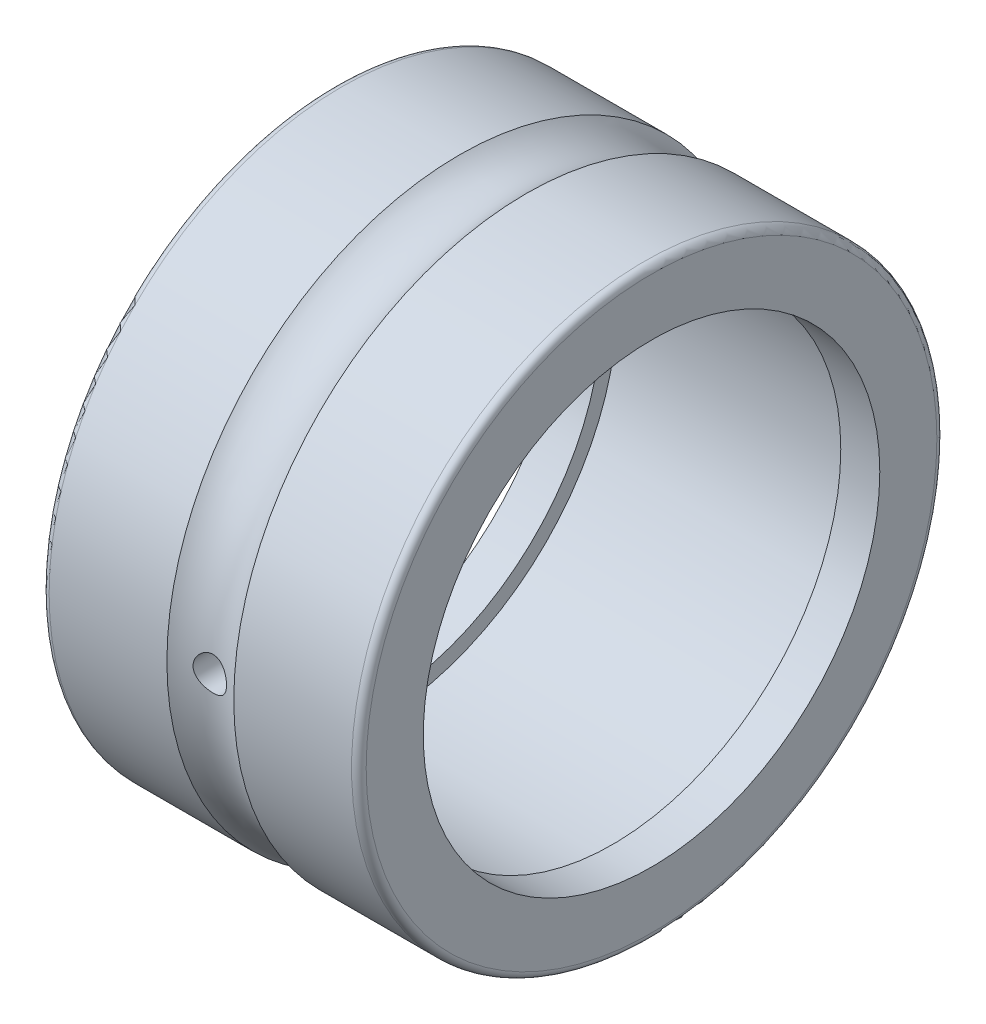
ISO-10303-21;
HEADER;
FILE_DESCRIPTION(('STEP AP214'),'2;1');
FILE_NAME('part.step','',(''),(''),'','','');
FILE_SCHEMA(('AUTOMOTIVE_DESIGN { 1 0 10303 214 1 1 1 1 }'));
ENDSEC;
DATA;
#1=APPLICATION_CONTEXT('core data for automotive mechanical design processes');
#2=APPLICATION_PROTOCOL_DEFINITION('international standard','automotive_design',2000,#1);
#3=PRODUCT_CONTEXT('',#1,'mechanical');
#4=PRODUCT('Part','Part','',(#3));
#5=PRODUCT_RELATED_PRODUCT_CATEGORY('part','',(#4));
#6=PRODUCT_DEFINITION_FORMATION('','',#4);
#7=PRODUCT_DEFINITION_CONTEXT('part definition',#1,'design');
#8=PRODUCT_DEFINITION('design','',#6,#7);
#9=PRODUCT_DEFINITION_SHAPE('','',#8);
#10=(LENGTH_UNIT() NAMED_UNIT(*) SI_UNIT(.MILLI.,.METRE.));
#11=(NAMED_UNIT(*) PLANE_ANGLE_UNIT() SI_UNIT($,.RADIAN.));
#12=(NAMED_UNIT(*) SI_UNIT($,.STERADIAN.) SOLID_ANGLE_UNIT());
#13=UNCERTAINTY_MEASURE_WITH_UNIT(LENGTH_MEASURE(1.E-05),#10,'distance_accuracy_value','');
#14=(GEOMETRIC_REPRESENTATION_CONTEXT(3) GLOBAL_UNCERTAINTY_ASSIGNED_CONTEXT((#13)) GLOBAL_UNIT_ASSIGNED_CONTEXT((#10,
#11,#12)) REPRESENTATION_CONTEXT('',''));
#15=CARTESIAN_POINT('',(0.,0.,0.));
#16=DIRECTION('',(0.,0.,1.));
#17=DIRECTION('',(1.,0.,0.));
#18=AXIS2_PLACEMENT_3D('',#15,#16,#17);
#19=CARTESIAN_POINT('',(12.7,0.,0.));
#20=DIRECTION('',(1.,0.,0.));
#21=DIRECTION('',(0.,1.,0.));
#22=AXIS2_PLACEMENT_3D('',#19,#20,#21);
#23=TOROIDAL_SURFACE('',#22,11.7,0.299999999999997);
#24=CARTESIAN_POINT('',(12.7,0.,0.));
#25=DIRECTION('',(1.,0.,0.));
#26=DIRECTION('',(0.,0.,-1.));
#27=AXIS2_PLACEMENT_3D('',#24,#25,#26);
#28=CIRCLE('',#27,12.);
#29=CARTESIAN_POINT('',(12.7,0.,-12.));
#30=VERTEX_POINT('',#29);
#31=EDGE_CURVE('E88',#30,#30,#28,.F.);
#32=ORIENTED_EDGE('',*,*,#31,.F.);
#33=EDGE_LOOP('',(#32));
#34=FACE_BOUND('',#33,.T.);
#35=CARTESIAN_POINT('',(13.,0.,0.));
#36=DIRECTION('',(-1.,0.,0.));
#37=DIRECTION('',(0.,0.,1.));
#38=AXIS2_PLACEMENT_3D('',#35,#36,#37);
#39=CIRCLE('',#38,11.7);
#40=CARTESIAN_POINT('',(13.,0.,11.7));
#41=VERTEX_POINT('',#40);
#42=EDGE_CURVE('E91',#41,#41,#39,.F.);
#43=ORIENTED_EDGE('',*,*,#42,.F.);
#44=EDGE_LOOP('',(#43));
#45=FACE_BOUND('',#44,.T.);
#46=ADVANCED_FACE('F13',(#34,#45),#23,.T.);
#47=CARTESIAN_POINT('',(0.299999999999995,0.,0.));
#48=DIRECTION('',(1.,0.,0.));
#49=DIRECTION('',(0.,1.,0.));
#50=AXIS2_PLACEMENT_3D('',#47,#48,#49);
#51=TOROIDAL_SURFACE('',#50,11.7,0.300000000000002);
#52=CARTESIAN_POINT('',(0.,0.,0.));
#53=DIRECTION('',(1.,0.,0.));
#54=DIRECTION('',(0.,0.,1.));
#55=AXIS2_PLACEMENT_3D('',#52,#53,#54);
#56=CIRCLE('',#55,11.7);
#57=CARTESIAN_POINT('',(0.,0.,11.7));
#58=VERTEX_POINT('',#57);
#59=EDGE_CURVE('E142',#58,#58,#56,.F.);
#60=ORIENTED_EDGE('',*,*,#59,.F.);
#61=EDGE_LOOP('',(#60));
#62=FACE_BOUND('',#61,.T.);
#63=CARTESIAN_POINT('',(0.299999999999995,0.,0.));
#64=DIRECTION('',(1.,0.,0.));
#65=DIRECTION('',(0.,0.,-1.));
#66=AXIS2_PLACEMENT_3D('',#63,#64,#65);
#67=CIRCLE('',#66,12.);
#68=CARTESIAN_POINT('',(0.299999999999995,0.,-12.));
#69=VERTEX_POINT('',#68);
#70=EDGE_CURVE('E85',#69,#69,#67,.T.);
#71=ORIENTED_EDGE('',*,*,#70,.F.);
#72=EDGE_LOOP('',(#71));
#73=FACE_BOUND('',#72,.T.);
#74=ADVANCED_FACE('F117',(#62,#73),#51,.T.);
#75=CARTESIAN_POINT('',(0.,0.,10.53));
#76=DIRECTION('',(-1.,0.,0.));
#77=DIRECTION('',(0.,0.,1.));
#78=AXIS2_PLACEMENT_3D('',#75,#76,#77);
#79=PLANE('',#78);
#80=CARTESIAN_POINT('',(0.,0.,0.));
#81=DIRECTION('',(1.,0.,0.));
#82=DIRECTION('',(0.,0.,-1.));
#83=AXIS2_PLACEMENT_3D('',#80,#81,#82);
#84=CIRCLE('',#83,9.36);
#85=CARTESIAN_POINT('',(0.,0.,-9.36));
#86=VERTEX_POINT('',#85);
#87=EDGE_CURVE('E18',#86,#86,#84,.F.);
#88=ORIENTED_EDGE('',*,*,#87,.F.);
#89=EDGE_LOOP('',(#88));
#90=FACE_BOUND('',#89,.T.);
#91=ORIENTED_EDGE('',*,*,#59,.T.);
#92=EDGE_LOOP('',(#91));
#93=FACE_BOUND('',#92,.T.);
#94=ADVANCED_FACE('F113',(#90,#93),#79,.T.);
#95=CARTESIAN_POINT('',(13.,0.,10.53));
#96=DIRECTION('',(1.,0.,0.));
#97=DIRECTION('',(0.,0.,-1.));
#98=AXIS2_PLACEMENT_3D('',#95,#96,#97);
#99=PLANE('',#98);
#100=ORIENTED_EDGE('',*,*,#42,.T.);
#101=EDGE_LOOP('',(#100));
#102=FACE_BOUND('',#101,.T.);
#103=CARTESIAN_POINT('',(13.,0.,0.));
#104=DIRECTION('',(1.,0.,0.));
#105=DIRECTION('',(0.,0.,-1.));
#106=AXIS2_PLACEMENT_3D('',#103,#104,#105);
#107=CIRCLE('',#106,9.36);
#108=CARTESIAN_POINT('',(13.,0.,-9.36));
#109=VERTEX_POINT('',#108);
#110=EDGE_CURVE('E84',#109,#109,#107,.T.);
#111=ORIENTED_EDGE('',*,*,#110,.F.);
#112=EDGE_LOOP('',(#111));
#113=FACE_BOUND('',#112,.T.);
#114=ADVANCED_FACE('F102',(#102,#113),#99,.T.);
#115=CARTESIAN_POINT('',(10.2857386528409,0.,0.));
#116=DIRECTION('',(1.,0.,0.));
#117=DIRECTION('',(0.,0.,-1.));
#118=AXIS2_PLACEMENT_3D('',#115,#116,#117);
#119=CYLINDRICAL_SURFACE('',#118,12.);
#120=ORIENTED_EDGE('',*,*,#31,.T.);
#121=EDGE_LOOP('',(#120));
#122=FACE_BOUND('',#121,.T.);
#123=CARTESIAN_POINT('',(7.87147730568172,0.,0.));
#124=DIRECTION('',(1.,0.,0.));
#125=DIRECTION('',(0.,1.,0.));
#126=AXIS2_PLACEMENT_3D('',#123,#124,#125);
#127=CIRCLE('',#126,12.);
#128=CARTESIAN_POINT('',(7.87147730568172,12.,0.));
#129=VERTEX_POINT('',#128);
#130=EDGE_CURVE('E81',#129,#129,#127,.F.);
#131=ORIENTED_EDGE('',*,*,#130,.F.);
#132=EDGE_LOOP('',(#131));
#133=FACE_BOUND('',#132,.T.);
#134=ADVANCED_FACE('F112',(#122,#133),#119,.T.);
#135=CARTESIAN_POINT('',(2.71426134715913,0.,0.));
#136=DIRECTION('',(1.,0.,0.));
#137=DIRECTION('',(0.,0.,-1.));
#138=AXIS2_PLACEMENT_3D('',#135,#136,#137);
#139=CYLINDRICAL_SURFACE('',#138,12.);
#140=CARTESIAN_POINT('',(5.12852269431827,0.,0.));
#141=DIRECTION('',(1.,0.,0.));
#142=DIRECTION('',(0.,1.,0.));
#143=AXIS2_PLACEMENT_3D('',#140,#141,#142);
#144=CIRCLE('',#143,12.);
#145=CARTESIAN_POINT('',(5.12852269431827,12.,0.));
#146=VERTEX_POINT('',#145);
#147=EDGE_CURVE('E77',#146,#146,#144,.T.);
#148=ORIENTED_EDGE('',*,*,#147,.F.);
#149=EDGE_LOOP('',(#148));
#150=FACE_BOUND('',#149,.T.);
#151=ORIENTED_EDGE('',*,*,#70,.T.);
#152=EDGE_LOOP('',(#151));
#153=FACE_BOUND('',#152,.T.);
#154=ADVANCED_FACE('F148',(#150,#153),#139,.T.);
#155=CARTESIAN_POINT('',(0.,0.,0.));
#156=DIRECTION('',(1.,0.,0.));
#157=DIRECTION('',(0.,0.,-1.));
#158=AXIS2_PLACEMENT_3D('',#155,#156,#157);
#159=CYLINDRICAL_SURFACE('',#158,9.36);
#160=ORIENTED_EDGE('',*,*,#87,.T.);
#161=EDGE_LOOP('',(#160));
#162=FACE_BOUND('',#161,.T.);
#163=CARTESIAN_POINT('',(1.59999999999999,0.,0.));
#164=DIRECTION('',(1.,0.,0.));
#165=DIRECTION('',(0.,0.,-1.));
#166=AXIS2_PLACEMENT_3D('',#163,#164,#165);
#167=CIRCLE('',#166,9.36);
#168=CARTESIAN_POINT('',(1.59999999999999,0.,-9.36));
#169=VERTEX_POINT('',#168);
#170=EDGE_CURVE('E80',#169,#169,#167,.F.);
#171=ORIENTED_EDGE('',*,*,#170,.F.);
#172=EDGE_LOOP('',(#171));
#173=FACE_BOUND('',#172,.T.);
#174=ADVANCED_FACE('F150',(#162,#173),#159,.F.);
#175=CARTESIAN_POINT('',(11.4,0.,0.));
#176=DIRECTION('',(1.,0.,0.));
#177=DIRECTION('',(0.,0.,-1.));
#178=AXIS2_PLACEMENT_3D('',#175,#176,#177);
#179=CYLINDRICAL_SURFACE('',#178,9.36);
#180=CARTESIAN_POINT('',(11.4,0.,0.));
#181=DIRECTION('',(1.,0.,0.));
#182=DIRECTION('',(0.,0.,-1.));
#183=AXIS2_PLACEMENT_3D('',#180,#181,#182);
#184=CIRCLE('',#183,9.36);
#185=CARTESIAN_POINT('',(11.4,0.,-9.36));
#186=VERTEX_POINT('',#185);
#187=EDGE_CURVE('E166',#186,#186,#184,.T.);
#188=ORIENTED_EDGE('',*,*,#187,.F.);
#189=EDGE_LOOP('',(#188));
#190=FACE_BOUND('',#189,.T.);
#191=ORIENTED_EDGE('',*,*,#110,.T.);
#192=EDGE_LOOP('',(#191));
#193=FACE_BOUND('',#192,.T.);
#194=ADVANCED_FACE('F71',(#190,#193),#179,.F.);
#195=CARTESIAN_POINT('',(6.50000000000001,0.,0.));
#196=DIRECTION('',(1.,0.,0.));
#197=DIRECTION('',(0.,1.,0.));
#198=AXIS2_PLACEMENT_3D('',#195,#196,#197);
#199=TOROIDAL_SURFACE('',#198,13.63095,2.13095);
#200=ORIENTED_EDGE('',*,*,#147,.T.);
#201=EDGE_LOOP('',(#200));
#202=FACE_BOUND('',#201,.T.);
#203=ORIENTED_EDGE('',*,*,#130,.T.);
#204=EDGE_LOOP('',(#203));
#205=FACE_BOUND('',#204,.T.);
#206=CARTESIAN_POINT('',(5.81424999999999,0.,11.6133536974657));
#207=CARTESIAN_POINT('',(5.81425221246483,0.0369930017704013,11.6133516820933));
#208=CARTESIAN_POINT('',(5.81725828513917,0.0740210176924062,11.612144677591));
#209=CARTESIAN_POINT('',(5.82916810280104,0.147001013069551,11.6074622620365));
#210=CARTESIAN_POINT('',(5.83808110978393,0.18295120984003,11.6039832886922));
#211=CARTESIAN_POINT('',(5.86141897264667,0.252608472393286,11.5951965633687));
#212=CARTESIAN_POINT('',(5.87582173348925,0.286323902223058,11.5898961505879));
#213=CARTESIAN_POINT('',(5.90971435157681,0.350927742971836,11.5780402418132));
#214=CARTESIAN_POINT('',(5.92921465128762,0.381810172899871,11.571482176913));
#215=CARTESIAN_POINT('',(5.97374085123082,0.441298662085632,11.5574894221417));
#216=CARTESIAN_POINT('',(5.99897180001102,0.469745198671992,11.5500288827974));
#217=CARTESIAN_POINT('',(6.05375539662706,0.5220645053994,11.5352817617333));
#218=CARTESIAN_POINT('',(6.08330076693407,0.545944824153944,11.5279949106519));
#219=CARTESIAN_POINT('',(6.14722307369872,0.589361531450228,11.5140921531174));
#220=CARTESIAN_POINT('',(6.18173631915777,0.608709096703539,11.507510138966));
#221=CARTESIAN_POINT('',(6.25381806679941,0.641256262742699,11.4960976274847));
#222=CARTESIAN_POINT('',(6.29138545423475,0.654458094962912,11.4912664945744));
#223=CARTESIAN_POINT('',(6.36679859148809,0.673765167913636,11.4841018110387));
#224=CARTESIAN_POINT('',(6.40456289220247,0.680151181484067,11.4816697868035));
#225=CARTESIAN_POINT('',(6.48070004695469,0.686541050750344,11.4792363876883));
#226=CARTESIAN_POINT('',(6.51907268685358,0.686547104446688,11.4792341756983));
#227=CARTESIAN_POINT('',(6.59322105795895,0.680349442568491,11.4815941936856));
#228=CARTESIAN_POINT('',(6.62902828667826,0.674467643831518,11.4838338498279));
#229=CARTESIAN_POINT('',(6.69910447082819,0.657200912343623,11.490254734411));
#230=CARTESIAN_POINT('',(6.73337328946445,0.645815491269516,11.4944361351368));
#231=CARTESIAN_POINT('',(6.80002532117708,0.617710722572696,11.5043922502801));
#232=CARTESIAN_POINT('',(6.83237138078751,0.600911953070414,11.5101905040655));
#233=CARTESIAN_POINT('',(6.8938736464765,0.562522794213706,11.5227780550014));
#234=CARTESIAN_POINT('',(6.92302860171107,0.540930535886537,11.5295677383543));
#235=CARTESIAN_POINT('',(6.97918529395205,0.492039498548158,11.5439118435528));
#236=CARTESIAN_POINT('',(7.00595026886744,0.46447462907763,11.5514876823492));
#237=CARTESIAN_POINT('',(7.05457156619989,0.405183744959176,11.5662177226057));
#238=CARTESIAN_POINT('',(7.07642526690924,0.373455522099316,11.5733716973729));
#239=CARTESIAN_POINT('',(7.11501792050027,0.305864787327376,11.5865931982073));
#240=CARTESIAN_POINT('',(7.13163575862927,0.269927577350443,11.5926338178382));
#241=CARTESIAN_POINT('',(7.15847132418616,0.1955141358573,11.6026495930157));
#242=CARTESIAN_POINT('',(7.16870261138473,0.157043476746049,11.6066291215387));
#243=CARTESIAN_POINT('',(7.17892755727919,0.0984961560319227,11.6106436985231));
#244=CARTESIAN_POINT('',(7.18148213338719,0.0789014630545076,11.6116559618107));
#245=CARTESIAN_POINT('',(7.18489394581804,0.0395411820350626,11.6130114998511));
#246=CARTESIAN_POINT('',(7.18575118273198,0.0197755940525483,11.6133547748367));
#247=CARTESIAN_POINT('',(7.18574778753514,-0.0369930017704012,11.6133516820933));
#248=CARTESIAN_POINT('',(7.18274171486083,-0.0740210176924065,11.612144677591));
#249=CARTESIAN_POINT('',(7.17083189719899,-0.14700101306955,11.6074622620365));
#250=CARTESIAN_POINT('',(7.16191889021609,-0.182951209840029,11.6039832886922));
#251=CARTESIAN_POINT('',(7.13858102735334,-0.252608472393285,11.5951965633687));
#252=CARTESIAN_POINT('',(7.12417826651076,-0.286323902223057,11.5898961505879));
#253=CARTESIAN_POINT('',(7.0902856484232,-0.350927742971834,11.5780402418132));
#254=CARTESIAN_POINT('',(7.07078534871239,-0.381810172899868,11.571482176913));
#255=CARTESIAN_POINT('',(7.02625914876919,-0.441298662085629,11.5574894221417));
#256=CARTESIAN_POINT('',(7.00102819998899,-0.46974519867199,11.5500288827974));
#257=CARTESIAN_POINT('',(6.94624460337296,-0.522064505399399,11.5352817617333));
#258=CARTESIAN_POINT('',(6.91669923306595,-0.545944824153942,11.5279949106519));
#259=CARTESIAN_POINT('',(6.85277692630129,-0.589361531450226,11.5140921531174));
#260=CARTESIAN_POINT('',(6.81826368084224,-0.608709096703538,11.507510138966));
#261=CARTESIAN_POINT('',(6.7461819332006,-0.641256262742699,11.4960976274847));
#262=CARTESIAN_POINT('',(6.70861454576526,-0.654458094962914,11.4912664945744));
#263=CARTESIAN_POINT('',(6.63320140851191,-0.673765167913638,11.4841018110387));
#264=CARTESIAN_POINT('',(6.59543710779753,-0.680151181484066,11.4816697868035));
#265=CARTESIAN_POINT('',(6.51929995304531,-0.686541050750347,11.4792363876883));
#266=CARTESIAN_POINT('',(6.48092731314641,-0.686547104446697,11.4792341756983));
#267=CARTESIAN_POINT('',(6.40677894204104,-0.680349442568497,11.4815941936856));
#268=CARTESIAN_POINT('',(6.37097171332173,-0.674467643831519,11.4838338498279));
#269=CARTESIAN_POINT('',(6.30089552917182,-0.657200912343616,11.490254734411));
#270=CARTESIAN_POINT('',(6.26662671053556,-0.645815491269508,11.4944361351368));
#271=CARTESIAN_POINT('',(6.19997467882293,-0.617710722572691,11.5043922502801));
#272=CARTESIAN_POINT('',(6.1676286192125,-0.600911953070412,11.5101905040655));
#273=CARTESIAN_POINT('',(6.10612635352351,-0.562522794213707,11.5227780550014));
#274=CARTESIAN_POINT('',(6.07697139828894,-0.540930535886539,11.5295677383543));
#275=CARTESIAN_POINT('',(6.02081470604796,-0.49203949854816,11.5439118435528));
#276=CARTESIAN_POINT('',(5.99404973113257,-0.464474629077631,11.5514876823492));
#277=CARTESIAN_POINT('',(5.94542843380012,-0.405183744959177,11.5662177226057));
#278=CARTESIAN_POINT('',(5.92357473309077,-0.373455522099318,11.5733716973729));
#279=CARTESIAN_POINT('',(5.88498207949974,-0.305864787327374,11.5865931982073));
#280=CARTESIAN_POINT('',(5.86836424137075,-0.269927577350438,11.5926338178382));
#281=CARTESIAN_POINT('',(5.84152867581384,-0.195514135857297,11.6026495930157));
#282=CARTESIAN_POINT('',(5.83129738861524,-0.157043476746051,11.6066291215387));
#283=CARTESIAN_POINT('',(5.8210724427208,-0.0984961560319226,11.6106436985231));
#284=CARTESIAN_POINT('',(5.81851786661282,-0.0789014630545052,11.6116559618107));
#285=CARTESIAN_POINT('',(5.81510605418197,-0.0395411820350592,11.6130114998511));
#286=CARTESIAN_POINT('',(5.81424881726801,-0.019775594052546,11.6133547748367));
#287=CARTESIAN_POINT('',(5.81424999999999,0.,11.6133536974657));
#288=B_SPLINE_CURVE_WITH_KNOTS('',3,(#206,#207,#208,#209,#210,#211,#212,#213,#214,#215,#216,
#217,#218,#219,#220,#221,#222,#223,#224,#225,#226,#227,#228,#229,#230,#231,#232,#233,#234,#235,
#236,#237,#238,#239,#240,#241,#242,#243,#244,#245,#246,#247,#248,#249,#250,#251,#252,#253,#254,
#255,#256,#257,#258,#259,#260,#261,#262,#263,#264,#265,#266,#267,#268,#269,#270,#271,#272,#273,
#274,#275,#276,#277,#278,#279,#280,#281,#282,#283,#284,#285,#286,#287),.UNSPECIFIED.,.T.,.F.,(4,
2,2,2,2,2,2,2,2,2,2,2,2,2,2,2,2,2,2,2,2,2,2,2,2,2,2,2,2,2,2,2,2,2,2,2,2,2,2,2,4),(0.,
0.110901751298274,0.221977807811578,0.332611449494097,0.443473528265625,0.55920407625924,
0.674741618884037,0.794466933138917,0.914148742745354,1.02868364039009,1.14317907887688,
1.25173872961309,1.36030801435473,1.47054882113733,1.5808326863408,1.69778441415607,
1.81479842494599,1.93434843649934,2.05364375121655,2.11292925583047,2.17221473979856,
2.28311649109684,2.39419254761014,2.50482618929266,2.61568826806418,2.7314188160578,
2.8469563586826,2.96668167293748,3.08636348254392,3.20089838018866,3.31539381867547,
3.42395346941166,3.53252275415329,3.64276356093589,3.75304742613936,3.86999915395463,
3.98701316474455,4.10656317629791,4.22585849101512,4.28514399562903,4.34442947959713),.UNSPECIFIED.);
#289=CARTESIAN_POINT('',(5.81424999999999,0.,11.6133536974657));
#290=VERTEX_POINT('',#289);
#291=EDGE_CURVE('E164',#290,#290,#288,.T.);
#292=ORIENTED_EDGE('',*,*,#291,.T.);
#293=EDGE_LOOP('',(#292));
#294=FACE_BOUND('',#293,.T.);
#295=ADVANCED_FACE('F62',(#202,#205,#294),#199,.F.);
#296=CARTESIAN_POINT('',(1.59999999999999,0.,9.68));
#297=DIRECTION('',(1.,0.,0.));
#298=DIRECTION('',(0.,0.,-1.));
#299=AXIS2_PLACEMENT_3D('',#296,#297,#298);
#300=PLANE('',#299);
#301=CARTESIAN_POINT('',(1.59999999999999,0.,0.));
#302=DIRECTION('',(1.,0.,0.));
#303=DIRECTION('',(0.,0.,-1.));
#304=AXIS2_PLACEMENT_3D('',#301,#302,#303);
#305=CIRCLE('',#304,10.);
#306=CARTESIAN_POINT('',(1.59999999999999,0.,-10.));
#307=VERTEX_POINT('',#306);
#308=EDGE_CURVE('E27',#307,#307,#305,.F.);
#309=ORIENTED_EDGE('',*,*,#308,.F.);
#310=EDGE_LOOP('',(#309));
#311=FACE_BOUND('',#310,.T.);
#312=ORIENTED_EDGE('',*,*,#170,.T.);
#313=EDGE_LOOP('',(#312));
#314=FACE_BOUND('',#313,.T.);
#315=ADVANCED_FACE('F57',(#311,#314),#300,.T.);
#316=CARTESIAN_POINT('',(11.4,0.,9.68));
#317=DIRECTION('',(-1.,0.,0.));
#318=DIRECTION('',(0.,0.,1.));
#319=AXIS2_PLACEMENT_3D('',#316,#317,#318);
#320=PLANE('',#319);
#321=ORIENTED_EDGE('',*,*,#187,.T.);
#322=EDGE_LOOP('',(#321));
#323=FACE_BOUND('',#322,.T.);
#324=CARTESIAN_POINT('',(11.4,0.,0.));
#325=DIRECTION('',(1.,0.,0.));
#326=DIRECTION('',(0.,0.,-1.));
#327=AXIS2_PLACEMENT_3D('',#324,#325,#326);
#328=CIRCLE('',#327,10.);
#329=CARTESIAN_POINT('',(11.4,0.,-10.));
#330=VERTEX_POINT('',#329);
#331=EDGE_CURVE('E22',#330,#330,#328,.T.);
#332=ORIENTED_EDGE('',*,*,#331,.F.);
#333=EDGE_LOOP('',(#332));
#334=FACE_BOUND('',#333,.T.);
#335=ADVANCED_FACE('F49',(#323,#334),#320,.T.);
#336=CARTESIAN_POINT('',(6.50000000000001,0.,6.));
#337=DIRECTION('',(0.,0.,1.));
#338=DIRECTION('',(1.,0.,0.));
#339=AXIS2_PLACEMENT_3D('',#336,#337,#338);
#340=CYLINDRICAL_SURFACE('',#339,0.68575);
#341=CARTESIAN_POINT('',(6.50000000000001,-0.68575,9.97645963944625));
#342=CARTESIAN_POINT('',(6.5384722947647,-0.685748355441796,9.97645994580954));
#343=CARTESIAN_POINT('',(6.57696983122001,-0.682501687113951,9.97668456281601));
#344=CARTESIAN_POINT('',(6.65289973826857,-0.669597508982949,9.97755878974932));
#345=CARTESIAN_POINT('',(6.69033089518142,-0.659932976715299,9.97820886520403));
#346=CARTESIAN_POINT('',(6.76302022742906,-0.634472296210458,9.97986005416601));
#347=CARTESIAN_POINT('',(6.7982794733745,-0.618679197441968,9.98086099306579));
#348=CARTESIAN_POINT('',(6.86563687660958,-0.581415519736044,9.98310085500436));
#349=CARTESIAN_POINT('',(6.89773580888826,-0.559946337501181,9.98433971947679));
#350=CARTESIAN_POINT('',(6.9579253383042,-0.511900785171911,9.98691822142577));
#351=CARTESIAN_POINT('',(6.98600995570981,-0.485316931632085,9.98825800479045));
#352=CARTESIAN_POINT('',(7.03732877333867,-0.427804142284238,9.99088636887213));
#353=CARTESIAN_POINT('',(7.06056169377591,-0.396874063614375,9.99217493600687));
#354=CARTESIAN_POINT('',(7.10153822844647,-0.331504976006534,9.99455726249323));
#355=CARTESIAN_POINT('',(7.11927406623082,-0.297061086920872,9.99565074494925));
#356=CARTESIAN_POINT('',(7.14869003516664,-0.225700132730853,9.9975161057263));
#357=CARTESIAN_POINT('',(7.1603768513902,-0.188785848971814,9.99828833888965));
#358=CARTESIAN_POINT('',(7.17448182925861,-0.12639019174395,9.99923213573535));
#359=CARTESIAN_POINT('',(7.17870168613889,-0.101303035513703,9.99951873387232));
#360=CARTESIAN_POINT('',(7.18433631019179,-0.0508142565964103,9.99990276599776));
#361=CARTESIAN_POINT('',(7.18575108642042,-0.0254126349248625,10.0000002005969));
#362=CARTESIAN_POINT('',(7.18574835525715,0.0384724442052598,9.99999969631431));
#363=CARTESIAN_POINT('',(7.18250166130446,0.0769701299471842,9.99977562020546));
#364=CARTESIAN_POINT('',(7.16959739125826,0.152900283797576,9.99890332620982));
#365=CARTESIAN_POINT('',(7.15993280296047,0.190331540018535,9.9982546444091));
#366=CARTESIAN_POINT('',(7.1344721514637,0.263020492029135,9.99660649377166));
#367=CARTESIAN_POINT('',(7.11867923532453,0.298279292681122,9.99560720500618));
#368=CARTESIAN_POINT('',(7.08141549376806,0.36563703575351,9.99337013522286));
#369=CARTESIAN_POINT('',(7.05994587007638,0.397736644984927,9.99213240469678));
#370=CARTESIAN_POINT('',(7.01189688958522,0.457929967614206,9.98955507797993));
#371=CARTESIAN_POINT('',(6.98530960733364,0.48601734839048,9.98821532576421));
#372=CARTESIAN_POINT('',(6.92779654805962,0.53733469220348,9.98558628041129));
#373=CARTESIAN_POINT('',(6.89687059535295,0.560564458447646,9.9842969893201));
#374=CARTESIAN_POINT('',(6.83152110853121,0.601527524596278,9.98191302225981));
#375=CARTESIAN_POINT('',(6.79709418466861,0.619255428844978,9.98081853778252));
#376=CARTESIAN_POINT('',(6.72574377726871,0.648677028172512,9.97894967946311));
#377=CARTESIAN_POINT('',(6.68882032795683,0.660370805955538,9.97817530123362));
#378=CARTESIAN_POINT('',(6.61358708776477,0.677374315012889,9.97703549667687));
#379=CARTESIAN_POINT('',(6.57527959022025,0.682694149234862,9.97666942323452));
#380=CARTESIAN_POINT('',(6.49831368088032,0.686829958055512,9.97638557399004));
#381=CARTESIAN_POINT('',(6.45965527321318,0.68564600906905,9.9764677929208));
#382=CARTESIAN_POINT('',(6.38315411032703,0.676816234173396,9.97707065612));
#383=CARTESIAN_POINT('',(6.34531008141931,0.669181385559644,9.9775905555956));
#384=CARTESIAN_POINT('',(6.2714416465336,0.647683456394117,9.97900902924658));
#385=CARTESIAN_POINT('',(6.23541726963676,0.633820276337954,9.97990760947179));
#386=CARTESIAN_POINT('',(6.16617471926854,0.600246214359744,9.98198307989601));
#387=CARTESIAN_POINT('',(6.13295906001092,0.580530162989797,9.98316021593743));
#388=CARTESIAN_POINT('',(6.07030738115888,0.535815610613062,9.985659782163));
#389=CARTESIAN_POINT('',(6.04087109527291,0.510817482105828,9.98698220209837));
#390=CARTESIAN_POINT('',(5.98655195604836,0.456191480824852,9.98962646058578));
#391=CARTESIAN_POINT('',(5.9616777358311,0.426555022995805,9.99094829340816));
#392=CARTESIAN_POINT('',(5.9172446222192,0.363506475079524,9.99344068467899));
#393=CARTESIAN_POINT('',(5.89768822243364,0.330092624074645,9.9946111720247));
#394=CARTESIAN_POINT('',(5.86444821345941,0.260420753772729,9.99666927599481));
#395=CARTESIAN_POINT('',(5.85076985707966,0.224160224667389,9.99755663942897));
#396=CARTESIAN_POINT('',(5.82972866250344,0.149909434699727,9.99894485254037));
#397=CARTESIAN_POINT('',(5.82235240152991,0.11192303254856,9.99944652347111));
#398=CARTESIAN_POINT('',(5.81557116644751,0.0491704297517214,9.9999093120658));
#399=CARTESIAN_POINT('',(5.81424799402364,0.0245921095971882,10.0000003156058));
#400=CARTESIAN_POINT('',(5.81425313617242,-0.0384476596800585,9.99999950657729));
#401=CARTESIAN_POINT('',(5.81749535921628,-0.0769290244089312,9.99977580498399));
#402=CARTESIAN_POINT('',(5.83039225040011,-0.152862947504298,9.99890404332975));
#403=CARTESIAN_POINT('',(5.84006053455071,-0.190313145106181,9.99825508223894));
#404=CARTESIAN_POINT('',(5.86552972818693,-0.263025232721352,9.99660636555627));
#405=CARTESIAN_POINT('',(5.88132518432731,-0.298289036403427,9.99560692197882));
#406=CARTESIAN_POINT('',(5.91859048284188,-0.365646084016021,9.99336979405784));
#407=CARTESIAN_POINT('',(5.94005754422701,-0.397740871261227,9.9921322265555));
#408=CARTESIAN_POINT('',(5.9880997560004,-0.457925816443529,9.98955525290096));
#409=CARTESIAN_POINT('',(6.0146828429776,-0.486009632594181,9.98821569049938));
#410=CARTESIAN_POINT('',(6.07219526778698,-0.53732836896179,9.98558663495719));
#411=CARTESIAN_POINT('',(6.10312596405294,-0.560561767979378,9.98429715762727));
#412=CARTESIAN_POINT('',(6.16849589898454,-0.601538719971368,9.98191235896804));
#413=CARTESIAN_POINT('',(6.20293996464445,-0.619274581133267,9.9808173105779));
#414=CARTESIAN_POINT('',(6.27430101110223,-0.648690425409135,9.97894883906533));
#415=CARTESIAN_POINT('',(6.31121519044702,-0.660377141918006,9.9781750585255));
#416=CARTESIAN_POINT('',(6.37361056986602,-0.674481964742666,9.97722926106922));
#417=CARTESIAN_POINT('',(6.39869754825589,-0.678701766540826,9.97694201630895));
#418=CARTESIAN_POINT('',(6.44918601366568,-0.684336325100907,9.97655710446466));
#419=CARTESIAN_POINT('',(6.47458750018838,-0.685751086296913,9.97645943708096));
#420=CARTESIAN_POINT('',(6.50000000000001,-0.68575,9.97645963944625));
#421=B_SPLINE_CURVE_WITH_KNOTS('',3,(#341,#342,#343,#344,#345,#346,#347,#348,#349,#350,#351,
#352,#353,#354,#355,#356,#357,#358,#359,#360,#361,#362,#363,#364,#365,#366,#367,#368,#369,#370,
#371,#372,#373,#374,#375,#376,#377,#378,#379,#380,#381,#382,#383,#384,#385,#386,#387,#388,#389,
#390,#391,#392,#393,#394,#395,#396,#397,#398,#399,#400,#401,#402,#403,#404,#405,#406,#407,#408,
#409,#410,#411,#412,#413,#414,#415,#416,#417,#418,#419,#420),.UNSPECIFIED.,.T.,.F.,(4,2,2,2,2,2,
2,2,2,2,2,2,2,2,2,2,2,2,2,2,2,2,2,2,2,2,2,2,2,2,2,2,2,2,2,2,2,2,2,4),(0.,0.115324293093953,
0.230774983093246,0.346168300334612,0.461533249356877,0.577068294256305,0.692633776729805,
0.80836200551587,0.92396206276876,1.00013905347572,1.07631579825001,1.19164054012477,
1.30709149381985,1.42248323866288,1.53785057528245,1.65339803404143,1.76895017297349,
1.88461527796065,2.00027879759107,2.1157587424971,2.23123733059819,2.34651980721589,
2.46180412566238,2.57719057149517,2.69256888282669,2.80816332929975,2.92381188670692,
3.03956357755792,3.1550681108971,3.22879477992204,3.34406012016515,3.45957047501336,
3.57497825760414,3.69032955635597,3.80586126564266,3.92142915400762,4.03715801541114,
4.1527577787232,4.22893423835867,4.30511057757761),.UNSPECIFIED.);
#422=CARTESIAN_POINT('',(6.50000000000001,-0.68575,9.97645963944625));
#423=VERTEX_POINT('',#422);
#424=EDGE_CURVE('E9',#423,#423,#421,.T.);
#425=ORIENTED_EDGE('',*,*,#424,.F.);
#426=EDGE_LOOP('',(#425));
#427=FACE_BOUND('',#426,.T.);
#428=ORIENTED_EDGE('',*,*,#291,.F.);
#429=EDGE_LOOP('',(#428));
#430=FACE_BOUND('',#429,.T.);
#431=ADVANCED_FACE('F38',(#427,#430),#340,.F.);
#432=CARTESIAN_POINT('',(1.59999999999999,0.,0.));
#433=DIRECTION('',(1.,0.,0.));
#434=DIRECTION('',(0.,0.,-1.));
#435=AXIS2_PLACEMENT_3D('',#432,#433,#434);
#436=CYLINDRICAL_SURFACE('',#435,10.);
#437=ORIENTED_EDGE('',*,*,#308,.T.);
#438=EDGE_LOOP('',(#437));
#439=FACE_BOUND('',#438,.T.);
#440=ORIENTED_EDGE('',*,*,#331,.T.);
#441=EDGE_LOOP('',(#440));
#442=FACE_BOUND('',#441,.T.);
#443=ORIENTED_EDGE('',*,*,#424,.T.);
#444=EDGE_LOOP('',(#443));
#445=FACE_BOUND('',#444,.T.);
#446=ADVANCED_FACE('F41',(#439,#442,#445),#436,.F.);
#447=CLOSED_SHELL('',(#46,#74,#94,#114,#134,#154,#174,#194,#295,#315,#335,#431,#446));
#448=MANIFOLD_SOLID_BREP('B1',#447);
#449=ADVANCED_BREP_SHAPE_REPRESENTATION('',(#18,#448),#14);
#450=SHAPE_DEFINITION_REPRESENTATION(#9,#449);
ENDSEC;
END-ISO-10303-21;
